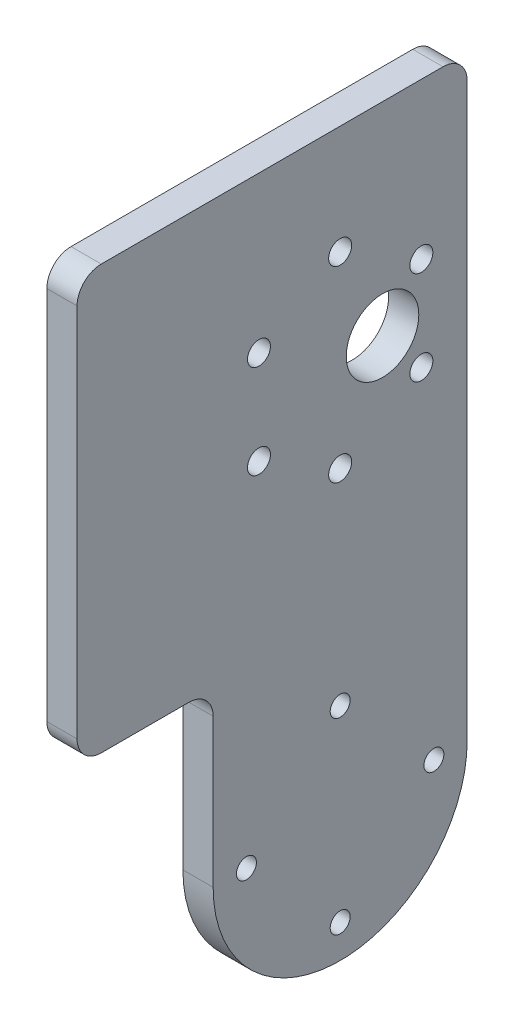
ISO-10303-21;
HEADER;
FILE_DESCRIPTION(('STEP AP214'),'2;1');
FILE_NAME('part.step','',(''),(''),'','','');
FILE_SCHEMA(('AUTOMOTIVE_DESIGN { 1 0 10303 214 1 1 1 1 }'));
ENDSEC;
DATA;
#1=APPLICATION_CONTEXT('core data for automotive mechanical design processes');
#2=APPLICATION_PROTOCOL_DEFINITION('international standard','automotive_design',2000,#1);
#3=PRODUCT_CONTEXT('',#1,'mechanical');
#4=PRODUCT('Part','Part','',(#3));
#5=PRODUCT_RELATED_PRODUCT_CATEGORY('part','',(#4));
#6=PRODUCT_DEFINITION_FORMATION('','',#4);
#7=PRODUCT_DEFINITION_CONTEXT('part definition',#1,'design');
#8=PRODUCT_DEFINITION('design','',#6,#7);
#9=PRODUCT_DEFINITION_SHAPE('','',#8);
#10=(LENGTH_UNIT() NAMED_UNIT(*) SI_UNIT(.MILLI.,.METRE.));
#11=(NAMED_UNIT(*) PLANE_ANGLE_UNIT() SI_UNIT($,.RADIAN.));
#12=(NAMED_UNIT(*) SI_UNIT($,.STERADIAN.) SOLID_ANGLE_UNIT());
#13=UNCERTAINTY_MEASURE_WITH_UNIT(LENGTH_MEASURE(1.E-05),#10,'distance_accuracy_value','');
#14=(GEOMETRIC_REPRESENTATION_CONTEXT(3) GLOBAL_UNCERTAINTY_ASSIGNED_CONTEXT((#13)) GLOBAL_UNIT_ASSIGNED_CONTEXT((#10,
#11,#12)) REPRESENTATION_CONTEXT('',''));
#15=CARTESIAN_POINT('',(0.,0.,0.));
#16=DIRECTION('',(0.,0.,1.));
#17=DIRECTION('',(1.,0.,0.));
#18=AXIS2_PLACEMENT_3D('',#15,#16,#17);
#19=CARTESIAN_POINT('',(5.,24.5,46.));
#20=DIRECTION('',(1.,0.,0.));
#21=DIRECTION('',(0.,0.,-1.));
#22=AXIS2_PLACEMENT_3D('',#19,#20,#21);
#23=PLANE('',#22);
#24=CARTESIAN_POINT('',(5.,72.75,7.57660624134119));
#25=DIRECTION('',(1.,0.,0.));
#26=DIRECTION('',(0.,0.,-1.));
#27=AXIS2_PLACEMENT_3D('',#24,#25,#26);
#28=CIRCLE('',#27,1.9);
#29=CARTESIAN_POINT('',(5.,72.75,5.67660624134119));
#30=VERTEX_POINT('',#29);
#31=EDGE_CURVE('E267',#30,#30,#28,.T.);
#32=ORIENTED_EDGE('',*,*,#31,.F.);
#33=EDGE_LOOP('',(#32));
#34=FACE_BOUND('',#33,.T.);
#35=CARTESIAN_POINT('',(5.,72.75,34.4233937586588));
#36=DIRECTION('',(1.,0.,0.));
#37=DIRECTION('',(0.,0.,-1.));
#38=AXIS2_PLACEMENT_3D('',#35,#36,#37);
#39=CIRCLE('',#38,1.9);
#40=CARTESIAN_POINT('',(5.,72.75,32.5233937586588));
#41=VERTEX_POINT('',#40);
#42=EDGE_CURVE('E255',#41,#41,#39,.T.);
#43=ORIENTED_EDGE('',*,*,#42,.F.);
#44=EDGE_LOOP('',(#43));
#45=FACE_BOUND('',#44,.T.);
#46=CARTESIAN_POINT('',(5.,65.,14.));
#47=DIRECTION('',(1.,0.,0.));
#48=DIRECTION('',(0.,0.,-1.));
#49=AXIS2_PLACEMENT_3D('',#46,#47,#48);
#50=CIRCLE('',#49,5.99999999999996);
#51=CARTESIAN_POINT('',(5.,65.,8.00000000000002));
#52=VERTEX_POINT('',#51);
#53=EDGE_CURVE('E243',#52,#52,#50,.T.);
#54=ORIENTED_EDGE('',*,*,#53,.F.);
#55=EDGE_LOOP('',(#54));
#56=FACE_BOUND('',#55,.T.);
#57=CARTESIAN_POINT('',(5.,-1.6306400674182E-13,5.5));
#58=DIRECTION('',(1.,0.,0.));
#59=DIRECTION('',(0.,0.,-1.));
#60=AXIS2_PLACEMENT_3D('',#57,#58,#59);
#61=CIRCLE('',#60,1.65);
#62=CARTESIAN_POINT('',(5.,-1.6306400674182E-13,3.85));
#63=VERTEX_POINT('',#62);
#64=EDGE_CURVE('E231',#63,#63,#61,.T.);
#65=ORIENTED_EDGE('',*,*,#64,.F.);
#66=EDGE_LOOP('',(#65));
#67=FACE_BOUND('',#66,.T.);
#68=CARTESIAN_POINT('',(5.,0.,36.5));
#69=DIRECTION('',(1.,0.,0.));
#70=DIRECTION('',(0.,0.,-1.));
#71=AXIS2_PLACEMENT_3D('',#68,#69,#70);
#72=CIRCLE('',#71,1.65);
#73=CARTESIAN_POINT('',(5.,0.,34.85));
#74=VERTEX_POINT('',#73);
#75=EDGE_CURVE('E219',#74,#74,#72,.T.);
#76=ORIENTED_EDGE('',*,*,#75,.F.);
#77=EDGE_LOOP('',(#76));
#78=FACE_BOUND('',#77,.T.);
#79=CARTESIAN_POINT('',(5.,24.5,46.));
#80=DIRECTION('',(-1.,0.,0.));
#81=DIRECTION('',(0.,0.,-1.));
#82=AXIS2_PLACEMENT_3D('',#79,#80,#81);
#83=CIRCLE('',#82,4.);
#84=CARTESIAN_POINT('',(5.,28.5,46.));
#85=VERTEX_POINT('',#84);
#86=CARTESIAN_POINT('',(5.,24.5,42.));
#87=VERTEX_POINT('',#86);
#88=EDGE_CURVE('E168',#85,#87,#83,.T.);
#89=ORIENTED_EDGE('',*,*,#88,.T.);
#90=DIRECTION('',(0.,-1.,0.));
#91=VECTOR('',#90,1.);
#92=CARTESIAN_POINT('',(5.,0.,42.));
#93=LINE('',#92,#91);
#94=CARTESIAN_POINT('',(5.,0.,42.));
#95=VERTEX_POINT('',#94);
#96=EDGE_CURVE('E106',#87,#95,#93,.T.);
#97=ORIENTED_EDGE('',*,*,#96,.T.);
#98=CARTESIAN_POINT('',(5.,0.,21.));
#99=DIRECTION('',(1.,0.,0.));
#100=DIRECTION('',(0.,0.,-1.));
#101=AXIS2_PLACEMENT_3D('',#98,#99,#100);
#102=CIRCLE('',#101,21.);
#103=CARTESIAN_POINT('',(5.,0.,0.));
#104=VERTEX_POINT('',#103);
#105=EDGE_CURVE('E189',#95,#104,#102,.T.);
#106=ORIENTED_EDGE('',*,*,#105,.T.);
#107=DIRECTION('',(0.,1.,0.));
#108=VECTOR('',#107,1.);
#109=CARTESIAN_POINT('',(5.,0.,0.));
#110=LINE('',#109,#108);
#111=CARTESIAN_POINT('',(5.,94.5,0.));
#112=VERTEX_POINT('',#111);
#113=EDGE_CURVE('E208',#104,#112,#110,.T.);
#114=ORIENTED_EDGE('',*,*,#113,.T.);
#115=CARTESIAN_POINT('',(5.,94.5,4.));
#116=DIRECTION('',(1.,0.,0.));
#117=DIRECTION('',(0.,0.,-1.));
#118=AXIS2_PLACEMENT_3D('',#115,#116,#117);
#119=CIRCLE('',#118,4.);
#120=CARTESIAN_POINT('',(5.,98.5,4.));
#121=VERTEX_POINT('',#120);
#122=EDGE_CURVE('E205',#112,#121,#119,.T.);
#123=ORIENTED_EDGE('',*,*,#122,.T.);
#124=DIRECTION('',(0.,0.,1.));
#125=VECTOR('',#124,1.);
#126=CARTESIAN_POINT('',(5.,98.5,4.));
#127=LINE('',#126,#125);
#128=CARTESIAN_POINT('',(5.,98.5,60.5));
#129=VERTEX_POINT('',#128);
#130=EDGE_CURVE('E207',#121,#129,#127,.T.);
#131=ORIENTED_EDGE('',*,*,#130,.T.);
#132=CARTESIAN_POINT('',(5.,94.5,60.5));
#133=DIRECTION('',(1.,0.,0.));
#134=DIRECTION('',(0.,0.,1.));
#135=AXIS2_PLACEMENT_3D('',#132,#133,#134);
#136=CIRCLE('',#135,4.);
#137=CARTESIAN_POINT('',(5.,94.5,64.5));
#138=VERTEX_POINT('',#137);
#139=EDGE_CURVE('E131',#129,#138,#136,.T.);
#140=ORIENTED_EDGE('',*,*,#139,.T.);
#141=DIRECTION('',(0.,-1.,0.));
#142=VECTOR('',#141,1.);
#143=CARTESIAN_POINT('',(5.,32.5,64.5));
#144=LINE('',#143,#142);
#145=CARTESIAN_POINT('',(5.,32.5,64.5));
#146=VERTEX_POINT('',#145);
#147=EDGE_CURVE('E125',#138,#146,#144,.T.);
#148=ORIENTED_EDGE('',*,*,#147,.T.);
#149=CARTESIAN_POINT('',(5.,32.5,60.5));
#150=DIRECTION('',(1.,0.,0.));
#151=DIRECTION('',(0.,0.,1.));
#152=AXIS2_PLACEMENT_3D('',#149,#150,#151);
#153=CIRCLE('',#152,4.);
#154=CARTESIAN_POINT('',(5.,28.5,60.5));
#155=VERTEX_POINT('',#154);
#156=EDGE_CURVE('E129',#146,#155,#153,.T.);
#157=ORIENTED_EDGE('',*,*,#156,.T.);
#158=DIRECTION('',(0.,0.,-1.));
#159=VECTOR('',#158,1.);
#160=CARTESIAN_POINT('',(5.,28.5,46.));
#161=LINE('',#160,#159);
#162=EDGE_CURVE('E57',#155,#85,#161,.T.);
#163=ORIENTED_EDGE('',*,*,#162,.T.);
#164=EDGE_LOOP('',(#89,#97,#106,#114,#123,#131,#140,#148,#157,#163));
#165=FACE_BOUND('',#164,.T.);
#166=CARTESIAN_POINT('',(5.,-15.5,21.));
#167=DIRECTION('',(1.,0.,0.));
#168=DIRECTION('',(0.,0.,-1.));
#169=AXIS2_PLACEMENT_3D('',#166,#167,#168);
#170=CIRCLE('',#169,1.65);
#171=CARTESIAN_POINT('',(5.,-15.5,19.35));
#172=VERTEX_POINT('',#171);
#173=EDGE_CURVE('E153',#172,#172,#170,.T.);
#174=ORIENTED_EDGE('',*,*,#173,.F.);
#175=EDGE_LOOP('',(#174));
#176=FACE_BOUND('',#175,.T.);
#177=CARTESIAN_POINT('',(5.,15.5,20.9999999999999));
#178=DIRECTION('',(1.,0.,0.));
#179=DIRECTION('',(0.,0.,-1.));
#180=AXIS2_PLACEMENT_3D('',#177,#178,#179);
#181=CIRCLE('',#180,1.65);
#182=CARTESIAN_POINT('',(5.,15.5,19.3499999999999));
#183=VERTEX_POINT('',#182);
#184=EDGE_CURVE('E225',#183,#183,#181,.T.);
#185=ORIENTED_EDGE('',*,*,#184,.F.);
#186=EDGE_LOOP('',(#185));
#187=FACE_BOUND('',#186,.T.);
#188=CARTESIAN_POINT('',(5.,57.25,34.4233937586588));
#189=DIRECTION('',(1.,0.,0.));
#190=DIRECTION('',(0.,0.,-1.));
#191=AXIS2_PLACEMENT_3D('',#188,#189,#190);
#192=CIRCLE('',#191,1.89999999999999);
#193=CARTESIAN_POINT('',(5.,57.25,32.5233937586588));
#194=VERTEX_POINT('',#193);
#195=EDGE_CURVE('E237',#194,#194,#192,.T.);
#196=ORIENTED_EDGE('',*,*,#195,.F.);
#197=EDGE_LOOP('',(#196));
#198=FACE_BOUND('',#197,.T.);
#199=CARTESIAN_POINT('',(5.,49.5,21.));
#200=DIRECTION('',(1.,0.,0.));
#201=DIRECTION('',(0.,0.,-1.));
#202=AXIS2_PLACEMENT_3D('',#199,#200,#201);
#203=CIRCLE('',#202,1.9);
#204=CARTESIAN_POINT('',(5.,49.5,19.1));
#205=VERTEX_POINT('',#204);
#206=EDGE_CURVE('E249',#205,#205,#203,.T.);
#207=ORIENTED_EDGE('',*,*,#206,.F.);
#208=EDGE_LOOP('',(#207));
#209=FACE_BOUND('',#208,.T.);
#210=CARTESIAN_POINT('',(5.,80.5,21.));
#211=DIRECTION('',(1.,0.,0.));
#212=DIRECTION('',(0.,0.,-1.));
#213=AXIS2_PLACEMENT_3D('',#210,#211,#212);
#214=CIRCLE('',#213,1.90000000000002);
#215=CARTESIAN_POINT('',(5.,80.5,19.1));
#216=VERTEX_POINT('',#215);
#217=EDGE_CURVE('E261',#216,#216,#214,.T.);
#218=ORIENTED_EDGE('',*,*,#217,.F.);
#219=EDGE_LOOP('',(#218));
#220=FACE_BOUND('',#219,.T.);
#221=CARTESIAN_POINT('',(5.,57.25,7.57660624134119));
#222=DIRECTION('',(1.,0.,0.));
#223=DIRECTION('',(0.,0.,-1.));
#224=AXIS2_PLACEMENT_3D('',#221,#222,#223);
#225=CIRCLE('',#224,1.90000000000002);
#226=CARTESIAN_POINT('',(5.,57.25,5.67660624134118));
#227=VERTEX_POINT('',#226);
#228=EDGE_CURVE('E273',#227,#227,#225,.T.);
#229=ORIENTED_EDGE('',*,*,#228,.F.);
#230=EDGE_LOOP('',(#229));
#231=FACE_BOUND('',#230,.T.);
#232=ADVANCED_FACE('F40',(#34,#45,#56,#67,#78,#165,#176,#187,#198,#209,#220,#231),#23,.T.);
#233=CARTESIAN_POINT('',(0.,24.5,46.));
#234=DIRECTION('',(1.,0.,0.));
#235=DIRECTION('',(0.,0.,-1.));
#236=AXIS2_PLACEMENT_3D('',#233,#234,#235);
#237=PLANE('',#236);
#238=CARTESIAN_POINT('',(0.,24.5,46.));
#239=DIRECTION('',(-1.,0.,0.));
#240=DIRECTION('',(0.,0.,-1.));
#241=AXIS2_PLACEMENT_3D('',#238,#239,#240);
#242=CIRCLE('',#241,4.);
#243=CARTESIAN_POINT('',(0.,28.5,46.));
#244=VERTEX_POINT('',#243);
#245=CARTESIAN_POINT('',(0.,24.5,42.));
#246=VERTEX_POINT('',#245);
#247=EDGE_CURVE('E149',#244,#246,#242,.T.);
#248=ORIENTED_EDGE('',*,*,#247,.F.);
#249=DIRECTION('',(0.,0.,-1.));
#250=VECTOR('',#249,1.);
#251=CARTESIAN_POINT('',(0.,28.5,46.));
#252=LINE('',#251,#250);
#253=CARTESIAN_POINT('',(0.,28.5,60.5));
#254=VERTEX_POINT('',#253);
#255=EDGE_CURVE('E98',#254,#244,#252,.T.);
#256=ORIENTED_EDGE('',*,*,#255,.F.);
#257=CARTESIAN_POINT('',(0.,32.5,60.5));
#258=DIRECTION('',(1.,0.,0.));
#259=DIRECTION('',(0.,0.,1.));
#260=AXIS2_PLACEMENT_3D('',#257,#258,#259);
#261=CIRCLE('',#260,4.);
#262=CARTESIAN_POINT('',(0.,32.5,64.5));
#263=VERTEX_POINT('',#262);
#264=EDGE_CURVE('E92',#263,#254,#261,.T.);
#265=ORIENTED_EDGE('',*,*,#264,.F.);
#266=DIRECTION('',(0.,-1.,0.));
#267=VECTOR('',#266,1.);
#268=CARTESIAN_POINT('',(0.,32.5,64.5));
#269=LINE('',#268,#267);
#270=CARTESIAN_POINT('',(0.,94.5,64.5));
#271=VERTEX_POINT('',#270);
#272=EDGE_CURVE('E139',#271,#263,#269,.T.);
#273=ORIENTED_EDGE('',*,*,#272,.F.);
#274=CARTESIAN_POINT('',(0.,94.5,60.5));
#275=DIRECTION('',(1.,0.,0.));
#276=DIRECTION('',(0.,0.,1.));
#277=AXIS2_PLACEMENT_3D('',#274,#275,#276);
#278=CIRCLE('',#277,4.);
#279=CARTESIAN_POINT('',(0.,98.5,60.5));
#280=VERTEX_POINT('',#279);
#281=EDGE_CURVE('E163',#280,#271,#278,.T.);
#282=ORIENTED_EDGE('',*,*,#281,.F.);
#283=DIRECTION('',(0.,0.,1.));
#284=VECTOR('',#283,1.);
#285=CARTESIAN_POINT('',(0.,98.5,4.));
#286=LINE('',#285,#284);
#287=CARTESIAN_POINT('',(0.,98.5,4.));
#288=VERTEX_POINT('',#287);
#289=EDGE_CURVE('E161',#288,#280,#286,.T.);
#290=ORIENTED_EDGE('',*,*,#289,.F.);
#291=CARTESIAN_POINT('',(0.,94.5,4.));
#292=DIRECTION('',(1.,0.,0.));
#293=DIRECTION('',(0.,0.,-1.));
#294=AXIS2_PLACEMENT_3D('',#291,#292,#293);
#295=CIRCLE('',#294,4.);
#296=CARTESIAN_POINT('',(0.,94.5,0.));
#297=VERTEX_POINT('',#296);
#298=EDGE_CURVE('E159',#297,#288,#295,.T.);
#299=ORIENTED_EDGE('',*,*,#298,.F.);
#300=DIRECTION('',(0.,1.,0.));
#301=VECTOR('',#300,1.);
#302=CARTESIAN_POINT('',(0.,0.,0.));
#303=LINE('',#302,#301);
#304=CARTESIAN_POINT('',(0.,0.,0.));
#305=VERTEX_POINT('',#304);
#306=EDGE_CURVE('E157',#305,#297,#303,.T.);
#307=ORIENTED_EDGE('',*,*,#306,.F.);
#308=CARTESIAN_POINT('',(0.,0.,21.));
#309=DIRECTION('',(1.,0.,0.));
#310=DIRECTION('',(0.,0.,-1.));
#311=AXIS2_PLACEMENT_3D('',#308,#309,#310);
#312=CIRCLE('',#311,21.);
#313=CARTESIAN_POINT('',(0.,0.,42.));
#314=VERTEX_POINT('',#313);
#315=EDGE_CURVE('E155',#314,#305,#312,.T.);
#316=ORIENTED_EDGE('',*,*,#315,.F.);
#317=DIRECTION('',(0.,-1.,0.));
#318=VECTOR('',#317,1.);
#319=CARTESIAN_POINT('',(0.,0.,42.));
#320=LINE('',#319,#318);
#321=EDGE_CURVE('E152',#246,#314,#320,.T.);
#322=ORIENTED_EDGE('',*,*,#321,.F.);
#323=EDGE_LOOP('',(#248,#256,#265,#273,#282,#290,#299,#307,#316,#322));
#324=FACE_BOUND('',#323,.T.);
#325=CARTESIAN_POINT('',(0.,-15.5,21.));
#326=DIRECTION('',(1.,0.,0.));
#327=DIRECTION('',(0.,0.,-1.));
#328=AXIS2_PLACEMENT_3D('',#325,#326,#327);
#329=CIRCLE('',#328,1.65);
#330=CARTESIAN_POINT('',(0.,-15.5,19.35));
#331=VERTEX_POINT('',#330);
#332=EDGE_CURVE('E216',#331,#331,#329,.T.);
#333=ORIENTED_EDGE('',*,*,#332,.T.);
#334=EDGE_LOOP('',(#333));
#335=FACE_BOUND('',#334,.T.);
#336=CARTESIAN_POINT('',(0.,0.,36.5));
#337=DIRECTION('',(1.,0.,0.));
#338=DIRECTION('',(0.,0.,-1.));
#339=AXIS2_PLACEMENT_3D('',#336,#337,#338);
#340=CIRCLE('',#339,1.65);
#341=CARTESIAN_POINT('',(0.,0.,34.85));
#342=VERTEX_POINT('',#341);
#343=EDGE_CURVE('E222',#342,#342,#340,.T.);
#344=ORIENTED_EDGE('',*,*,#343,.T.);
#345=EDGE_LOOP('',(#344));
#346=FACE_BOUND('',#345,.T.);
#347=CARTESIAN_POINT('',(0.,15.5,20.9999999999999));
#348=DIRECTION('',(1.,0.,0.));
#349=DIRECTION('',(0.,0.,-1.));
#350=AXIS2_PLACEMENT_3D('',#347,#348,#349);
#351=CIRCLE('',#350,1.65);
#352=CARTESIAN_POINT('',(0.,15.5,19.3499999999999));
#353=VERTEX_POINT('',#352);
#354=EDGE_CURVE('E228',#353,#353,#351,.T.);
#355=ORIENTED_EDGE('',*,*,#354,.T.);
#356=EDGE_LOOP('',(#355));
#357=FACE_BOUND('',#356,.T.);
#358=CARTESIAN_POINT('',(0.,-1.6306400674182E-13,5.5));
#359=DIRECTION('',(1.,0.,0.));
#360=DIRECTION('',(0.,0.,-1.));
#361=AXIS2_PLACEMENT_3D('',#358,#359,#360);
#362=CIRCLE('',#361,1.65);
#363=CARTESIAN_POINT('',(0.,-1.6306400674182E-13,3.85));
#364=VERTEX_POINT('',#363);
#365=EDGE_CURVE('E234',#364,#364,#362,.T.);
#366=ORIENTED_EDGE('',*,*,#365,.T.);
#367=EDGE_LOOP('',(#366));
#368=FACE_BOUND('',#367,.T.);
#369=CARTESIAN_POINT('',(0.,57.25,34.4233937586588));
#370=DIRECTION('',(1.,0.,0.));
#371=DIRECTION('',(0.,0.,-1.));
#372=AXIS2_PLACEMENT_3D('',#369,#370,#371);
#373=CIRCLE('',#372,1.89999999999999);
#374=CARTESIAN_POINT('',(0.,57.25,32.5233937586588));
#375=VERTEX_POINT('',#374);
#376=EDGE_CURVE('E240',#375,#375,#373,.T.);
#377=ORIENTED_EDGE('',*,*,#376,.T.);
#378=EDGE_LOOP('',(#377));
#379=FACE_BOUND('',#378,.T.);
#380=CARTESIAN_POINT('',(0.,65.,14.));
#381=DIRECTION('',(1.,0.,0.));
#382=DIRECTION('',(0.,0.,-1.));
#383=AXIS2_PLACEMENT_3D('',#380,#381,#382);
#384=CIRCLE('',#383,5.99999999999996);
#385=CARTESIAN_POINT('',(0.,65.,8.00000000000002));
#386=VERTEX_POINT('',#385);
#387=EDGE_CURVE('E246',#386,#386,#384,.T.);
#388=ORIENTED_EDGE('',*,*,#387,.T.);
#389=EDGE_LOOP('',(#388));
#390=FACE_BOUND('',#389,.T.);
#391=CARTESIAN_POINT('',(0.,49.5,21.));
#392=DIRECTION('',(1.,0.,0.));
#393=DIRECTION('',(0.,0.,-1.));
#394=AXIS2_PLACEMENT_3D('',#391,#392,#393);
#395=CIRCLE('',#394,1.9);
#396=CARTESIAN_POINT('',(0.,49.5,19.1));
#397=VERTEX_POINT('',#396);
#398=EDGE_CURVE('E252',#397,#397,#395,.T.);
#399=ORIENTED_EDGE('',*,*,#398,.T.);
#400=EDGE_LOOP('',(#399));
#401=FACE_BOUND('',#400,.T.);
#402=CARTESIAN_POINT('',(0.,72.75,34.4233937586588));
#403=DIRECTION('',(1.,0.,0.));
#404=DIRECTION('',(0.,0.,-1.));
#405=AXIS2_PLACEMENT_3D('',#402,#403,#404);
#406=CIRCLE('',#405,1.9);
#407=CARTESIAN_POINT('',(0.,72.75,32.5233937586588));
#408=VERTEX_POINT('',#407);
#409=EDGE_CURVE('E258',#408,#408,#406,.T.);
#410=ORIENTED_EDGE('',*,*,#409,.T.);
#411=EDGE_LOOP('',(#410));
#412=FACE_BOUND('',#411,.T.);
#413=CARTESIAN_POINT('',(0.,80.5,21.));
#414=DIRECTION('',(1.,0.,0.));
#415=DIRECTION('',(0.,0.,-1.));
#416=AXIS2_PLACEMENT_3D('',#413,#414,#415);
#417=CIRCLE('',#416,1.90000000000002);
#418=CARTESIAN_POINT('',(0.,80.5,19.1));
#419=VERTEX_POINT('',#418);
#420=EDGE_CURVE('E264',#419,#419,#417,.T.);
#421=ORIENTED_EDGE('',*,*,#420,.T.);
#422=EDGE_LOOP('',(#421));
#423=FACE_BOUND('',#422,.T.);
#424=CARTESIAN_POINT('',(0.,72.75,7.57660624134119));
#425=DIRECTION('',(1.,0.,0.));
#426=DIRECTION('',(0.,0.,-1.));
#427=AXIS2_PLACEMENT_3D('',#424,#425,#426);
#428=CIRCLE('',#427,1.9);
#429=CARTESIAN_POINT('',(0.,72.75,5.67660624134119));
#430=VERTEX_POINT('',#429);
#431=EDGE_CURVE('E270',#430,#430,#428,.T.);
#432=ORIENTED_EDGE('',*,*,#431,.T.);
#433=EDGE_LOOP('',(#432));
#434=FACE_BOUND('',#433,.T.);
#435=CARTESIAN_POINT('',(0.,57.25,7.57660624134119));
#436=DIRECTION('',(1.,0.,0.));
#437=DIRECTION('',(0.,0.,-1.));
#438=AXIS2_PLACEMENT_3D('',#435,#436,#437);
#439=CIRCLE('',#438,1.90000000000002);
#440=CARTESIAN_POINT('',(0.,57.25,5.67660624134118));
#441=VERTEX_POINT('',#440);
#442=EDGE_CURVE('E276',#441,#441,#439,.T.);
#443=ORIENTED_EDGE('',*,*,#442,.T.);
#444=EDGE_LOOP('',(#443));
#445=FACE_BOUND('',#444,.T.);
#446=ADVANCED_FACE('F193',(#324,#335,#346,#357,#368,#379,#390,#401,#412,#423,#434,#445),#237,.F.);
#447=CARTESIAN_POINT('',(5.,24.5,46.));
#448=DIRECTION('',(-1.,0.,0.));
#449=DIRECTION('',(0.,0.,1.));
#450=AXIS2_PLACEMENT_3D('',#447,#448,#449);
#451=CYLINDRICAL_SURFACE('',#450,4.);
#452=ORIENTED_EDGE('',*,*,#247,.T.);
#453=DIRECTION('',(-1.,0.,0.));
#454=VECTOR('',#453,1.);
#455=CARTESIAN_POINT('',(5.,24.5,42.));
#456=LINE('',#455,#454);
#457=EDGE_CURVE('E11',#87,#246,#456,.T.);
#458=ORIENTED_EDGE('',*,*,#457,.F.);
#459=ORIENTED_EDGE('',*,*,#88,.F.);
#460=DIRECTION('',(-1.,0.,0.));
#461=VECTOR('',#460,1.);
#462=CARTESIAN_POINT('',(5.,28.5,46.));
#463=LINE('',#462,#461);
#464=EDGE_CURVE('E145',#85,#244,#463,.T.);
#465=ORIENTED_EDGE('',*,*,#464,.T.);
#466=EDGE_LOOP('',(#452,#458,#459,#465));
#467=FACE_BOUND('',#466,.T.);
#468=ADVANCED_FACE('F42',(#467),#451,.F.);
#469=CARTESIAN_POINT('',(5.,0.,42.));
#470=DIRECTION('',(0.,0.,-1.));
#471=DIRECTION('',(0.,1.,0.));
#472=AXIS2_PLACEMENT_3D('',#469,#470,#471);
#473=PLANE('',#472);
#474=ORIENTED_EDGE('',*,*,#321,.T.);
#475=DIRECTION('',(-1.,0.,0.));
#476=VECTOR('',#475,1.);
#477=CARTESIAN_POINT('',(5.,0.,42.));
#478=LINE('',#477,#476);
#479=EDGE_CURVE('E49',#95,#314,#478,.T.);
#480=ORIENTED_EDGE('',*,*,#479,.F.);
#481=ORIENTED_EDGE('',*,*,#96,.F.);
#482=ORIENTED_EDGE('',*,*,#457,.T.);
#483=EDGE_LOOP('',(#474,#480,#481,#482));
#484=FACE_BOUND('',#483,.T.);
#485=ADVANCED_FACE('F318',(#484),#473,.F.);
#486=CARTESIAN_POINT('',(5.,0.,21.));
#487=DIRECTION('',(-1.,0.,0.));
#488=DIRECTION('',(0.,0.,1.));
#489=AXIS2_PLACEMENT_3D('',#486,#487,#488);
#490=CYLINDRICAL_SURFACE('',#489,21.);
#491=ORIENTED_EDGE('',*,*,#315,.T.);
#492=DIRECTION('',(-1.,0.,0.));
#493=VECTOR('',#492,1.);
#494=CARTESIAN_POINT('',(5.,0.,0.));
#495=LINE('',#494,#493);
#496=EDGE_CURVE('E181',#104,#305,#495,.T.);
#497=ORIENTED_EDGE('',*,*,#496,.F.);
#498=ORIENTED_EDGE('',*,*,#105,.F.);
#499=ORIENTED_EDGE('',*,*,#479,.T.);
#500=EDGE_LOOP('',(#491,#497,#498,#499));
#501=FACE_BOUND('',#500,.T.);
#502=ADVANCED_FACE('F187',(#501),#490,.T.);
#503=CARTESIAN_POINT('',(5.,0.,0.));
#504=DIRECTION('',(0.,0.,1.));
#505=DIRECTION('',(1.,0.,0.));
#506=AXIS2_PLACEMENT_3D('',#503,#504,#505);
#507=PLANE('',#506);
#508=ORIENTED_EDGE('',*,*,#306,.T.);
#509=DIRECTION('',(-1.,0.,0.));
#510=VECTOR('',#509,1.);
#511=CARTESIAN_POINT('',(5.,94.5,0.));
#512=LINE('',#511,#510);
#513=EDGE_CURVE('E178',#112,#297,#512,.T.);
#514=ORIENTED_EDGE('',*,*,#513,.F.);
#515=ORIENTED_EDGE('',*,*,#113,.F.);
#516=ORIENTED_EDGE('',*,*,#496,.T.);
#517=EDGE_LOOP('',(#508,#514,#515,#516));
#518=FACE_BOUND('',#517,.T.);
#519=ADVANCED_FACE('F199',(#518),#507,.F.);
#520=CARTESIAN_POINT('',(5.,94.5,4.));
#521=DIRECTION('',(-1.,0.,0.));
#522=DIRECTION('',(0.,0.,1.));
#523=AXIS2_PLACEMENT_3D('',#520,#521,#522);
#524=CYLINDRICAL_SURFACE('',#523,4.);
#525=ORIENTED_EDGE('',*,*,#298,.T.);
#526=DIRECTION('',(-1.,0.,0.));
#527=VECTOR('',#526,1.);
#528=CARTESIAN_POINT('',(5.,98.5,4.));
#529=LINE('',#528,#527);
#530=EDGE_CURVE('E175',#121,#288,#529,.T.);
#531=ORIENTED_EDGE('',*,*,#530,.F.);
#532=ORIENTED_EDGE('',*,*,#122,.F.);
#533=ORIENTED_EDGE('',*,*,#513,.T.);
#534=EDGE_LOOP('',(#525,#531,#532,#533));
#535=FACE_BOUND('',#534,.T.);
#536=ADVANCED_FACE('F203',(#535),#524,.T.);
#537=CARTESIAN_POINT('',(5.,98.5,4.));
#538=DIRECTION('',(0.,-1.,0.));
#539=DIRECTION('',(0.,0.,-1.));
#540=AXIS2_PLACEMENT_3D('',#537,#538,#539);
#541=PLANE('',#540);
#542=ORIENTED_EDGE('',*,*,#289,.T.);
#543=DIRECTION('',(-1.,0.,0.));
#544=VECTOR('',#543,1.);
#545=CARTESIAN_POINT('',(5.,98.5,60.5));
#546=LINE('',#545,#544);
#547=EDGE_CURVE('E172',#129,#280,#546,.T.);
#548=ORIENTED_EDGE('',*,*,#547,.F.);
#549=ORIENTED_EDGE('',*,*,#130,.F.);
#550=ORIENTED_EDGE('',*,*,#530,.T.);
#551=EDGE_LOOP('',(#542,#548,#549,#550));
#552=FACE_BOUND('',#551,.T.);
#553=ADVANCED_FACE('F308',(#552),#541,.F.);
#554=CARTESIAN_POINT('',(5.,94.5,60.5));
#555=DIRECTION('',(-1.,0.,0.));
#556=DIRECTION('',(0.,0.,1.));
#557=AXIS2_PLACEMENT_3D('',#554,#555,#556);
#558=CYLINDRICAL_SURFACE('',#557,4.);
#559=ORIENTED_EDGE('',*,*,#281,.T.);
#560=DIRECTION('',(-1.,0.,0.));
#561=VECTOR('',#560,1.);
#562=CARTESIAN_POINT('',(5.,94.5,64.5));
#563=LINE('',#562,#561);
#564=EDGE_CURVE('E140',#138,#271,#563,.T.);
#565=ORIENTED_EDGE('',*,*,#564,.F.);
#566=ORIENTED_EDGE('',*,*,#139,.F.);
#567=ORIENTED_EDGE('',*,*,#547,.T.);
#568=EDGE_LOOP('',(#559,#565,#566,#567));
#569=FACE_BOUND('',#568,.T.);
#570=ADVANCED_FACE('F305',(#569),#558,.T.);
#571=CARTESIAN_POINT('',(5.,32.5,64.5));
#572=DIRECTION('',(0.,0.,-1.));
#573=DIRECTION('',(-1.,0.,0.));
#574=AXIS2_PLACEMENT_3D('',#571,#572,#573);
#575=PLANE('',#574);
#576=ORIENTED_EDGE('',*,*,#272,.T.);
#577=DIRECTION('',(-1.,0.,0.));
#578=VECTOR('',#577,1.);
#579=CARTESIAN_POINT('',(5.,32.5,64.5));
#580=LINE('',#579,#578);
#581=EDGE_CURVE('E136',#146,#263,#580,.T.);
#582=ORIENTED_EDGE('',*,*,#581,.F.);
#583=ORIENTED_EDGE('',*,*,#147,.F.);
#584=ORIENTED_EDGE('',*,*,#564,.T.);
#585=EDGE_LOOP('',(#576,#582,#583,#584));
#586=FACE_BOUND('',#585,.T.);
#587=ADVANCED_FACE('F137',(#586),#575,.F.);
#588=CARTESIAN_POINT('',(5.,32.5,60.5));
#589=DIRECTION('',(-1.,0.,0.));
#590=DIRECTION('',(0.,0.,1.));
#591=AXIS2_PLACEMENT_3D('',#588,#589,#590);
#592=CYLINDRICAL_SURFACE('',#591,4.);
#593=ORIENTED_EDGE('',*,*,#264,.T.);
#594=DIRECTION('',(-1.,0.,0.));
#595=VECTOR('',#594,1.);
#596=CARTESIAN_POINT('',(5.,28.5,60.5));
#597=LINE('',#596,#595);
#598=EDGE_CURVE('E141',#155,#254,#597,.T.);
#599=ORIENTED_EDGE('',*,*,#598,.F.);
#600=ORIENTED_EDGE('',*,*,#156,.F.);
#601=ORIENTED_EDGE('',*,*,#581,.T.);
#602=EDGE_LOOP('',(#593,#599,#600,#601));
#603=FACE_BOUND('',#602,.T.);
#604=ADVANCED_FACE('F143',(#603),#592,.T.);
#605=CARTESIAN_POINT('',(5.,28.5,46.));
#606=DIRECTION('',(0.,1.,0.));
#607=DIRECTION('',(0.,0.,1.));
#608=AXIS2_PLACEMENT_3D('',#605,#606,#607);
#609=PLANE('',#608);
#610=ORIENTED_EDGE('',*,*,#255,.T.);
#611=ORIENTED_EDGE('',*,*,#464,.F.);
#612=ORIENTED_EDGE('',*,*,#162,.F.);
#613=ORIENTED_EDGE('',*,*,#598,.T.);
#614=EDGE_LOOP('',(#610,#611,#612,#613));
#615=FACE_BOUND('',#614,.T.);
#616=ADVANCED_FACE('F298',(#615),#609,.F.);
#617=CARTESIAN_POINT('',(5.,-15.5,21.));
#618=DIRECTION('',(-1.,0.,0.));
#619=DIRECTION('',(0.,0.,1.));
#620=AXIS2_PLACEMENT_3D('',#617,#618,#619);
#621=CYLINDRICAL_SURFACE('',#620,1.65);
#622=ORIENTED_EDGE('',*,*,#173,.T.);
#623=EDGE_LOOP('',(#622));
#624=FACE_BOUND('',#623,.T.);
#625=ORIENTED_EDGE('',*,*,#332,.F.);
#626=EDGE_LOOP('',(#625));
#627=FACE_BOUND('',#626,.T.);
#628=ADVANCED_FACE('F295',(#624,#627),#621,.F.);
#629=CARTESIAN_POINT('',(5.,0.,36.5));
#630=DIRECTION('',(-1.,0.,0.));
#631=DIRECTION('',(0.,0.,1.));
#632=AXIS2_PLACEMENT_3D('',#629,#630,#631);
#633=CYLINDRICAL_SURFACE('',#632,1.65);
#634=ORIENTED_EDGE('',*,*,#75,.T.);
#635=EDGE_LOOP('',(#634));
#636=FACE_BOUND('',#635,.T.);
#637=ORIENTED_EDGE('',*,*,#343,.F.);
#638=EDGE_LOOP('',(#637));
#639=FACE_BOUND('',#638,.T.);
#640=ADVANCED_FACE('F393',(#636,#639),#633,.F.);
#641=CARTESIAN_POINT('',(5.,15.5,20.9999999999999));
#642=DIRECTION('',(-1.,0.,0.));
#643=DIRECTION('',(0.,0.,1.));
#644=AXIS2_PLACEMENT_3D('',#641,#642,#643);
#645=CYLINDRICAL_SURFACE('',#644,1.65);
#646=ORIENTED_EDGE('',*,*,#184,.T.);
#647=EDGE_LOOP('',(#646));
#648=FACE_BOUND('',#647,.T.);
#649=ORIENTED_EDGE('',*,*,#354,.F.);
#650=EDGE_LOOP('',(#649));
#651=FACE_BOUND('',#650,.T.);
#652=ADVANCED_FACE('F401',(#648,#651),#645,.F.);
#653=CARTESIAN_POINT('',(5.,-1.6306400674182E-13,5.5));
#654=DIRECTION('',(-1.,0.,0.));
#655=DIRECTION('',(0.,0.,1.));
#656=AXIS2_PLACEMENT_3D('',#653,#654,#655);
#657=CYLINDRICAL_SURFACE('',#656,1.65);
#658=ORIENTED_EDGE('',*,*,#64,.T.);
#659=EDGE_LOOP('',(#658));
#660=FACE_BOUND('',#659,.T.);
#661=ORIENTED_EDGE('',*,*,#365,.F.);
#662=EDGE_LOOP('',(#661));
#663=FACE_BOUND('',#662,.T.);
#664=ADVANCED_FACE('F409',(#660,#663),#657,.F.);
#665=CARTESIAN_POINT('',(5.,57.25,34.4233937586588));
#666=DIRECTION('',(-1.,0.,0.));
#667=DIRECTION('',(0.,0.,1.));
#668=AXIS2_PLACEMENT_3D('',#665,#666,#667);
#669=CYLINDRICAL_SURFACE('',#668,1.89999999999999);
#670=ORIENTED_EDGE('',*,*,#195,.T.);
#671=EDGE_LOOP('',(#670));
#672=FACE_BOUND('',#671,.T.);
#673=ORIENTED_EDGE('',*,*,#376,.F.);
#674=EDGE_LOOP('',(#673));
#675=FACE_BOUND('',#674,.T.);
#676=ADVANCED_FACE('F418',(#672,#675),#669,.F.);
#677=CARTESIAN_POINT('',(5.,65.,14.));
#678=DIRECTION('',(-1.,0.,0.));
#679=DIRECTION('',(0.,0.,1.));
#680=AXIS2_PLACEMENT_3D('',#677,#678,#679);
#681=CYLINDRICAL_SURFACE('',#680,5.99999999999996);
#682=ORIENTED_EDGE('',*,*,#53,.T.);
#683=EDGE_LOOP('',(#682));
#684=FACE_BOUND('',#683,.T.);
#685=ORIENTED_EDGE('',*,*,#387,.F.);
#686=EDGE_LOOP('',(#685));
#687=FACE_BOUND('',#686,.T.);
#688=ADVANCED_FACE('F427',(#684,#687),#681,.F.);
#689=CARTESIAN_POINT('',(5.,49.5,21.));
#690=DIRECTION('',(-1.,0.,0.));
#691=DIRECTION('',(0.,0.,1.));
#692=AXIS2_PLACEMENT_3D('',#689,#690,#691);
#693=CYLINDRICAL_SURFACE('',#692,1.9);
#694=ORIENTED_EDGE('',*,*,#206,.T.);
#695=EDGE_LOOP('',(#694));
#696=FACE_BOUND('',#695,.T.);
#697=ORIENTED_EDGE('',*,*,#398,.F.);
#698=EDGE_LOOP('',(#697));
#699=FACE_BOUND('',#698,.T.);
#700=ADVANCED_FACE('F436',(#696,#699),#693,.F.);
#701=CARTESIAN_POINT('',(5.,72.75,34.4233937586588));
#702=DIRECTION('',(-1.,0.,0.));
#703=DIRECTION('',(0.,0.,1.));
#704=AXIS2_PLACEMENT_3D('',#701,#702,#703);
#705=CYLINDRICAL_SURFACE('',#704,1.9);
#706=ORIENTED_EDGE('',*,*,#42,.T.);
#707=EDGE_LOOP('',(#706));
#708=FACE_BOUND('',#707,.T.);
#709=ORIENTED_EDGE('',*,*,#409,.F.);
#710=EDGE_LOOP('',(#709));
#711=FACE_BOUND('',#710,.T.);
#712=ADVANCED_FACE('F445',(#708,#711),#705,.F.);
#713=CARTESIAN_POINT('',(5.,80.5,21.));
#714=DIRECTION('',(-1.,0.,0.));
#715=DIRECTION('',(0.,0.,1.));
#716=AXIS2_PLACEMENT_3D('',#713,#714,#715);
#717=CYLINDRICAL_SURFACE('',#716,1.90000000000002);
#718=ORIENTED_EDGE('',*,*,#217,.T.);
#719=EDGE_LOOP('',(#718));
#720=FACE_BOUND('',#719,.T.);
#721=ORIENTED_EDGE('',*,*,#420,.F.);
#722=EDGE_LOOP('',(#721));
#723=FACE_BOUND('',#722,.T.);
#724=ADVANCED_FACE('F454',(#720,#723),#717,.F.);
#725=CARTESIAN_POINT('',(5.,72.75,7.57660624134119));
#726=DIRECTION('',(-1.,0.,0.));
#727=DIRECTION('',(0.,0.,1.));
#728=AXIS2_PLACEMENT_3D('',#725,#726,#727);
#729=CYLINDRICAL_SURFACE('',#728,1.9);
#730=ORIENTED_EDGE('',*,*,#31,.T.);
#731=EDGE_LOOP('',(#730));
#732=FACE_BOUND('',#731,.T.);
#733=ORIENTED_EDGE('',*,*,#431,.F.);
#734=EDGE_LOOP('',(#733));
#735=FACE_BOUND('',#734,.T.);
#736=ADVANCED_FACE('F463',(#732,#735),#729,.F.);
#737=CARTESIAN_POINT('',(5.,57.25,7.57660624134119));
#738=DIRECTION('',(-1.,0.,0.));
#739=DIRECTION('',(0.,0.,1.));
#740=AXIS2_PLACEMENT_3D('',#737,#738,#739);
#741=CYLINDRICAL_SURFACE('',#740,1.90000000000002);
#742=ORIENTED_EDGE('',*,*,#228,.T.);
#743=EDGE_LOOP('',(#742));
#744=FACE_BOUND('',#743,.T.);
#745=ORIENTED_EDGE('',*,*,#442,.F.);
#746=EDGE_LOOP('',(#745));
#747=FACE_BOUND('',#746,.T.);
#748=ADVANCED_FACE('F282',(#744,#747),#741,.F.);
#749=CLOSED_SHELL('',(#232,#446,#468,#485,#502,#519,#536,#553,#570,#587,#604,#616,#628,#640,
#652,#664,#676,#688,#700,#712,#724,#736,#748));
#750=MANIFOLD_SOLID_BREP('B2',#749);
#751=ADVANCED_BREP_SHAPE_REPRESENTATION('',(#18,#750),#14);
#752=SHAPE_DEFINITION_REPRESENTATION(#9,#751);
ENDSEC;
END-ISO-10303-21;
